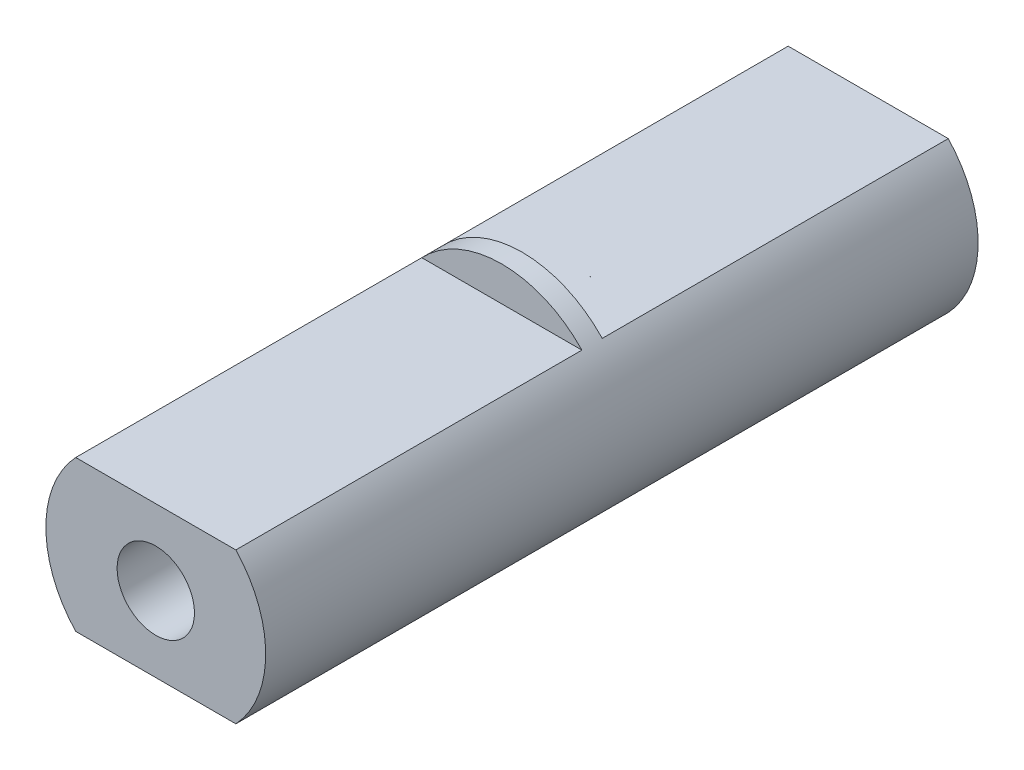
ISO-10303-21;
HEADER;
FILE_DESCRIPTION(('STEP AP214'),'2;1');
FILE_NAME('part.step','',(''),(''),'','','');
FILE_SCHEMA(('AUTOMOTIVE_DESIGN { 1 0 10303 214 1 1 1 1 }'));
ENDSEC;
DATA;
#1=APPLICATION_CONTEXT('core data for automotive mechanical design processes');
#2=APPLICATION_PROTOCOL_DEFINITION('international standard','automotive_design',2000,#1);
#3=PRODUCT_CONTEXT('',#1,'mechanical');
#4=PRODUCT('Part','Part','',(#3));
#5=PRODUCT_RELATED_PRODUCT_CATEGORY('part','',(#4));
#6=PRODUCT_DEFINITION_FORMATION('','',#4);
#7=PRODUCT_DEFINITION_CONTEXT('part definition',#1,'design');
#8=PRODUCT_DEFINITION('design','',#6,#7);
#9=PRODUCT_DEFINITION_SHAPE('','',#8);
#10=(LENGTH_UNIT() NAMED_UNIT(*) SI_UNIT(.MILLI.,.METRE.));
#11=(NAMED_UNIT(*) PLANE_ANGLE_UNIT() SI_UNIT($,.RADIAN.));
#12=(NAMED_UNIT(*) SI_UNIT($,.STERADIAN.) SOLID_ANGLE_UNIT());
#13=UNCERTAINTY_MEASURE_WITH_UNIT(LENGTH_MEASURE(1.E-05),#10,'distance_accuracy_value','');
#14=(GEOMETRIC_REPRESENTATION_CONTEXT(3) GLOBAL_UNCERTAINTY_ASSIGNED_CONTEXT((#13)) GLOBAL_UNIT_ASSIGNED_CONTEXT((#10,
#11,#12)) REPRESENTATION_CONTEXT('',''));
#15=CARTESIAN_POINT('',(0.,0.,0.));
#16=DIRECTION('',(0.,0.,1.));
#17=DIRECTION('',(1.,0.,0.));
#18=AXIS2_PLACEMENT_3D('',#15,#16,#17);
#19=CARTESIAN_POINT('',(0.,1.85,8.5));
#20=DIRECTION('',(0.,1.,0.));
#21=DIRECTION('',(0.,0.,1.));
#22=AXIS2_PLACEMENT_3D('',#19,#20,#21);
#23=PLANE('',#22);
#24=DIRECTION('',(1.,0.,0.));
#25=VECTOR('',#24,1.);
#26=CARTESIAN_POINT('',(0.,1.85,0.));
#27=LINE('',#26,#25);
#28=CARTESIAN_POINT('',(-1.96659612767848,1.85,0.));
#29=VERTEX_POINT('',#28);
#30=CARTESIAN_POINT('',(1.96659612767848,1.85,0.));
#31=VERTEX_POINT('',#30);
#32=EDGE_CURVE('E144',#29,#31,#27,.T.);
#33=ORIENTED_EDGE('',*,*,#32,.F.);
#34=DIRECTION('',(0.,0.,-1.));
#35=VECTOR('',#34,1.);
#36=CARTESIAN_POINT('',(-1.96659612767848,1.85,8.5));
#37=LINE('',#36,#35);
#38=CARTESIAN_POINT('',(-1.96659612767848,1.85,8.5));
#39=VERTEX_POINT('',#38);
#40=EDGE_CURVE('E49',#39,#29,#37,.T.);
#41=ORIENTED_EDGE('',*,*,#40,.F.);
#42=DIRECTION('',(1.,0.,0.));
#43=VECTOR('',#42,1.);
#44=CARTESIAN_POINT('',(0.,1.85,8.5));
#45=LINE('',#44,#43);
#46=CARTESIAN_POINT('',(1.96659612767848,1.85,8.5));
#47=VERTEX_POINT('',#46);
#48=EDGE_CURVE('E159',#39,#47,#45,.T.);
#49=ORIENTED_EDGE('',*,*,#48,.T.);
#50=DIRECTION('',(0.,0.,-1.));
#51=VECTOR('',#50,1.);
#52=CARTESIAN_POINT('',(1.96659612767848,1.85,8.5));
#53=LINE('',#52,#51);
#54=EDGE_CURVE('E11',#47,#31,#53,.T.);
#55=ORIENTED_EDGE('',*,*,#54,.T.);
#56=EDGE_LOOP('',(#33,#41,#49,#55));
#57=FACE_BOUND('',#56,.T.);
#58=ADVANCED_FACE('F40',(#57),#23,.T.);
#59=CARTESIAN_POINT('',(0.,0.,8.5));
#60=DIRECTION('',(0.,0.,-1.));
#61=DIRECTION('',(-1.,0.,0.));
#62=AXIS2_PLACEMENT_3D('',#59,#60,#61);
#63=CYLINDRICAL_SURFACE('',#62,2.700000061);
#64=ORIENTED_EDGE('',*,*,#40,.T.);
#65=CARTESIAN_POINT('',(0.,0.,0.));
#66=DIRECTION('',(0.,0.,-1.));
#67=DIRECTION('',(-1.,0.,0.));
#68=AXIS2_PLACEMENT_3D('',#65,#66,#67);
#69=CIRCLE('',#68,2.700000061);
#70=EDGE_CURVE('E145',#29,#31,#69,.T.);
#71=ORIENTED_EDGE('',*,*,#70,.T.);
#72=ORIENTED_EDGE('',*,*,#54,.F.);
#73=CARTESIAN_POINT('',(0.,0.,8.5));
#74=DIRECTION('',(0.,0.,1.));
#75=DIRECTION('',(1.,0.,0.));
#76=AXIS2_PLACEMENT_3D('',#73,#74,#75);
#77=CIRCLE('',#76,2.700000061);
#78=CARTESIAN_POINT('',(1.96659612767848,-1.85,8.5));
#79=VERTEX_POINT('',#78);
#80=EDGE_CURVE('E156',#79,#47,#77,.T.);
#81=ORIENTED_EDGE('',*,*,#80,.F.);
#82=DIRECTION('',(0.,0.,-1.));
#83=VECTOR('',#82,1.);
#84=CARTESIAN_POINT('',(1.96659612767848,-1.85,8.5));
#85=LINE('',#84,#83);
#86=CARTESIAN_POINT('',(1.96659612767848,-1.85,0.));
#87=VERTEX_POINT('',#86);
#88=EDGE_CURVE('E167',#79,#87,#85,.T.);
#89=ORIENTED_EDGE('',*,*,#88,.T.);
#90=CARTESIAN_POINT('',(-1.96659612767848,-1.85,0.));
#91=VERTEX_POINT('',#90);
#92=EDGE_CURVE('E140',#87,#91,#69,.T.);
#93=ORIENTED_EDGE('',*,*,#92,.T.);
#94=DIRECTION('',(0.,0.,-1.));
#95=VECTOR('',#94,1.);
#96=CARTESIAN_POINT('',(-1.96659612767848,-1.85,8.5));
#97=LINE('',#96,#95);
#98=CARTESIAN_POINT('',(-1.96659612767848,-1.85,8.5));
#99=VERTEX_POINT('',#98);
#100=EDGE_CURVE('E177',#99,#91,#97,.T.);
#101=ORIENTED_EDGE('',*,*,#100,.F.);
#102=CARTESIAN_POINT('',(0.,0.,8.5));
#103=DIRECTION('',(0.,0.,1.));
#104=DIRECTION('',(1.,0.,0.));
#105=AXIS2_PLACEMENT_3D('',#102,#103,#104);
#106=CIRCLE('',#105,2.700000061);
#107=EDGE_CURVE('E162',#39,#99,#106,.T.);
#108=ORIENTED_EDGE('',*,*,#107,.F.);
#109=EDGE_LOOP('',(#64,#71,#72,#81,#89,#93,#101,#108));
#110=FACE_BOUND('',#109,.T.);
#111=CARTESIAN_POINT('',(0.,0.,-0.499999999999999));
#112=DIRECTION('',(0.,0.,-1.));
#113=DIRECTION('',(-1.,0.,0.));
#114=AXIS2_PLACEMENT_3D('',#111,#112,#113);
#115=CIRCLE('',#114,2.700000061);
#116=CARTESIAN_POINT('',(1.96659612767848,-1.85,-0.499999999999999));
#117=VERTEX_POINT('',#116);
#118=CARTESIAN_POINT('',(-1.96659612767848,-1.85,-0.499999999999999));
#119=VERTEX_POINT('',#118);
#120=EDGE_CURVE('E109',#117,#119,#115,.T.);
#121=ORIENTED_EDGE('',*,*,#120,.F.);
#122=DIRECTION('',(0.,0.,-1.));
#123=VECTOR('',#122,1.);
#124=CARTESIAN_POINT('',(1.96659612767848,-1.85,-0.499999999999999));
#125=LINE('',#124,#123);
#126=CARTESIAN_POINT('',(1.96659612767848,-1.85,-9.));
#127=VERTEX_POINT('',#126);
#128=EDGE_CURVE('E117',#117,#127,#125,.T.);
#129=ORIENTED_EDGE('',*,*,#128,.T.);
#130=CARTESIAN_POINT('',(0.,0.,-9.));
#131=DIRECTION('',(0.,0.,-1.));
#132=DIRECTION('',(-1.,0.,0.));
#133=AXIS2_PLACEMENT_3D('',#130,#131,#132);
#134=CIRCLE('',#133,2.700000061);
#135=CARTESIAN_POINT('',(1.96659612767848,1.85,-9.));
#136=VERTEX_POINT('',#135);
#137=EDGE_CURVE('E141',#136,#127,#134,.T.);
#138=ORIENTED_EDGE('',*,*,#137,.F.);
#139=DIRECTION('',(0.,0.,-1.));
#140=VECTOR('',#139,1.);
#141=CARTESIAN_POINT('',(1.96659612767848,1.85,-0.499999999999999));
#142=LINE('',#141,#140);
#143=CARTESIAN_POINT('',(1.96659612767848,1.85,-0.499999999999999));
#144=VERTEX_POINT('',#143);
#145=EDGE_CURVE('E65',#144,#136,#142,.T.);
#146=ORIENTED_EDGE('',*,*,#145,.F.);
#147=CARTESIAN_POINT('',(0.,0.,-0.499999999999999));
#148=DIRECTION('',(0.,0.,-1.));
#149=DIRECTION('',(-1.,0.,0.));
#150=AXIS2_PLACEMENT_3D('',#147,#148,#149);
#151=CIRCLE('',#150,2.700000061);
#152=CARTESIAN_POINT('',(-1.96659612767848,1.85,-0.499999999999999));
#153=VERTEX_POINT('',#152);
#154=EDGE_CURVE('E128',#153,#144,#151,.T.);
#155=ORIENTED_EDGE('',*,*,#154,.F.);
#156=DIRECTION('',(0.,0.,-1.));
#157=VECTOR('',#156,1.);
#158=CARTESIAN_POINT('',(-1.96659612767848,1.85,-0.499999999999999));
#159=LINE('',#158,#157);
#160=CARTESIAN_POINT('',(-1.96659612767848,1.85,-9.));
#161=VERTEX_POINT('',#160);
#162=EDGE_CURVE('E134',#153,#161,#159,.T.);
#163=ORIENTED_EDGE('',*,*,#162,.T.);
#164=CARTESIAN_POINT('',(-1.96659612767848,-1.85,-9.));
#165=VERTEX_POINT('',#164);
#166=EDGE_CURVE('E122',#165,#161,#134,.T.);
#167=ORIENTED_EDGE('',*,*,#166,.F.);
#168=DIRECTION('',(0.,0.,-1.));
#169=VECTOR('',#168,1.);
#170=CARTESIAN_POINT('',(-1.96659612767848,-1.85,-0.499999999999999));
#171=LINE('',#170,#169);
#172=EDGE_CURVE('E57',#119,#165,#171,.T.);
#173=ORIENTED_EDGE('',*,*,#172,.F.);
#174=EDGE_LOOP('',(#121,#129,#138,#146,#155,#163,#167,#173));
#175=FACE_BOUND('',#174,.T.);
#176=ADVANCED_FACE('F120',(#110,#175),#63,.T.);
#177=CARTESIAN_POINT('',(0.,0.,8.5));
#178=DIRECTION('',(0.,0.,-1.));
#179=DIRECTION('',(-1.,0.,0.));
#180=AXIS2_PLACEMENT_3D('',#177,#178,#179);
#181=CYLINDRICAL_SURFACE('',#180,0.950000005);
#182=CARTESIAN_POINT('',(0.,0.,-9.));
#183=DIRECTION('',(0.,0.,-1.));
#184=DIRECTION('',(-1.,0.,0.));
#185=AXIS2_PLACEMENT_3D('',#182,#183,#184);
#186=CIRCLE('',#185,0.950000005);
#187=CARTESIAN_POINT('',(-0.950000005,0.,-9.));
#188=VERTEX_POINT('',#187);
#189=EDGE_CURVE('E136',#188,#188,#186,.T.);
#190=ORIENTED_EDGE('',*,*,#189,.T.);
#191=EDGE_LOOP('',(#190));
#192=FACE_BOUND('',#191,.T.);
#193=CARTESIAN_POINT('',(0.,0.,8.5));
#194=DIRECTION('',(0.,0.,1.));
#195=DIRECTION('',(1.,0.,0.));
#196=AXIS2_PLACEMENT_3D('',#193,#194,#195);
#197=CIRCLE('',#196,0.950000005);
#198=CARTESIAN_POINT('',(0.950000005,0.,8.5));
#199=VERTEX_POINT('',#198);
#200=EDGE_CURVE('E153',#199,#199,#197,.T.);
#201=ORIENTED_EDGE('',*,*,#200,.T.);
#202=EDGE_LOOP('',(#201));
#203=FACE_BOUND('',#202,.T.);
#204=ADVANCED_FACE('F42',(#192,#203),#181,.F.);
#205=CARTESIAN_POINT('',(0.,-1.85,8.5));
#206=DIRECTION('',(0.,-1.,0.));
#207=DIRECTION('',(0.,0.,-1.));
#208=AXIS2_PLACEMENT_3D('',#205,#206,#207);
#209=PLANE('',#208);
#210=DIRECTION('',(-1.,0.,0.));
#211=VECTOR('',#210,1.);
#212=CARTESIAN_POINT('',(0.,-1.85,0.));
#213=LINE('',#212,#211);
#214=EDGE_CURVE('E157',#87,#91,#213,.T.);
#215=ORIENTED_EDGE('',*,*,#214,.F.);
#216=ORIENTED_EDGE('',*,*,#88,.F.);
#217=DIRECTION('',(-1.,0.,0.));
#218=VECTOR('',#217,1.);
#219=CARTESIAN_POINT('',(0.,-1.85,8.5));
#220=LINE('',#219,#218);
#221=EDGE_CURVE('E164',#79,#99,#220,.T.);
#222=ORIENTED_EDGE('',*,*,#221,.T.);
#223=ORIENTED_EDGE('',*,*,#100,.T.);
#224=EDGE_LOOP('',(#215,#216,#222,#223));
#225=FACE_BOUND('',#224,.T.);
#226=ADVANCED_FACE('F192',(#225),#209,.T.);
#227=CARTESIAN_POINT('',(0.,0.,8.5));
#228=DIRECTION('',(0.,0.,1.));
#229=DIRECTION('',(1.,0.,0.));
#230=AXIS2_PLACEMENT_3D('',#227,#228,#229);
#231=PLANE('',#230);
#232=ORIENTED_EDGE('',*,*,#200,.F.);
#233=EDGE_LOOP('',(#232));
#234=FACE_BOUND('',#233,.T.);
#235=ORIENTED_EDGE('',*,*,#80,.T.);
#236=ORIENTED_EDGE('',*,*,#48,.F.);
#237=ORIENTED_EDGE('',*,*,#107,.T.);
#238=ORIENTED_EDGE('',*,*,#221,.F.);
#239=EDGE_LOOP('',(#235,#236,#237,#238));
#240=FACE_BOUND('',#239,.T.);
#241=ADVANCED_FACE('F197',(#234,#240),#231,.T.);
#242=CARTESIAN_POINT('',(0.,0.,0.));
#243=DIRECTION('',(0.,0.,-1.));
#244=DIRECTION('',(-1.,0.,0.));
#245=AXIS2_PLACEMENT_3D('',#242,#243,#244);
#246=PLANE('',#245);
#247=ORIENTED_EDGE('',*,*,#92,.F.);
#248=ORIENTED_EDGE('',*,*,#214,.T.);
#249=EDGE_LOOP('',(#247,#248));
#250=FACE_BOUND('',#249,.T.);
#251=ADVANCED_FACE('F194',(#250),#246,.F.);
#252=ORIENTED_EDGE('',*,*,#70,.F.);
#253=ORIENTED_EDGE('',*,*,#32,.T.);
#254=EDGE_LOOP('',(#252,#253));
#255=FACE_BOUND('',#254,.T.);
#256=ADVANCED_FACE('F196',(#255),#246,.F.);
#257=CARTESIAN_POINT('',(0.,0.,-9.));
#258=DIRECTION('',(0.,0.,-1.));
#259=DIRECTION('',(-1.,0.,0.));
#260=AXIS2_PLACEMENT_3D('',#257,#258,#259);
#261=PLANE('',#260);
#262=DIRECTION('',(1.,0.,0.));
#263=VECTOR('',#262,1.);
#264=CARTESIAN_POINT('',(-1.96659612767848,-1.85,-9.));
#265=LINE('',#264,#263);
#266=EDGE_CURVE('E114',#165,#127,#265,.T.);
#267=ORIENTED_EDGE('',*,*,#266,.F.);
#268=ORIENTED_EDGE('',*,*,#166,.T.);
#269=DIRECTION('',(-1.,0.,0.));
#270=VECTOR('',#269,1.);
#271=CARTESIAN_POINT('',(1.96659612767848,1.85,-9.));
#272=LINE('',#271,#270);
#273=EDGE_CURVE('E124',#136,#161,#272,.T.);
#274=ORIENTED_EDGE('',*,*,#273,.F.);
#275=ORIENTED_EDGE('',*,*,#137,.T.);
#276=EDGE_LOOP('',(#267,#268,#274,#275));
#277=FACE_BOUND('',#276,.T.);
#278=ORIENTED_EDGE('',*,*,#189,.F.);
#279=EDGE_LOOP('',(#278));
#280=FACE_BOUND('',#279,.T.);
#281=ADVANCED_FACE('F203',(#277,#280),#261,.T.);
#282=CARTESIAN_POINT('',(1.96659612767848,1.85,-0.499999999999999));
#283=DIRECTION('',(0.,-1.,0.));
#284=DIRECTION('',(0.,0.,-1.));
#285=AXIS2_PLACEMENT_3D('',#282,#283,#284);
#286=PLANE('',#285);
#287=ORIENTED_EDGE('',*,*,#273,.T.);
#288=ORIENTED_EDGE('',*,*,#162,.F.);
#289=DIRECTION('',(-1.,0.,0.));
#290=VECTOR('',#289,1.);
#291=CARTESIAN_POINT('',(1.96659612767848,1.85,-0.499999999999999));
#292=LINE('',#291,#290);
#293=EDGE_CURVE('E130',#144,#153,#292,.T.);
#294=ORIENTED_EDGE('',*,*,#293,.F.);
#295=ORIENTED_EDGE('',*,*,#145,.T.);
#296=EDGE_LOOP('',(#287,#288,#294,#295));
#297=FACE_BOUND('',#296,.T.);
#298=ADVANCED_FACE('F232',(#297),#286,.F.);
#299=CARTESIAN_POINT('',(0.,0.,-0.499999999999999));
#300=DIRECTION('',(0.,0.,-1.));
#301=DIRECTION('',(-1.,0.,0.));
#302=AXIS2_PLACEMENT_3D('',#299,#300,#301);
#303=PLANE('',#302);
#304=ORIENTED_EDGE('',*,*,#154,.T.);
#305=ORIENTED_EDGE('',*,*,#293,.T.);
#306=EDGE_LOOP('',(#304,#305));
#307=FACE_BOUND('',#306,.T.);
#308=ADVANCED_FACE('F237',(#307),#303,.T.);
#309=CARTESIAN_POINT('',(-1.96659612767848,-1.85,-0.499999999999999));
#310=DIRECTION('',(0.,1.,0.));
#311=DIRECTION('',(0.,0.,1.));
#312=AXIS2_PLACEMENT_3D('',#309,#310,#311);
#313=PLANE('',#312);
#314=ORIENTED_EDGE('',*,*,#266,.T.);
#315=ORIENTED_EDGE('',*,*,#128,.F.);
#316=DIRECTION('',(1.,0.,0.));
#317=VECTOR('',#316,1.);
#318=CARTESIAN_POINT('',(-1.96659612767848,-1.85,-0.499999999999999));
#319=LINE('',#318,#317);
#320=EDGE_CURVE('E111',#119,#117,#319,.T.);
#321=ORIENTED_EDGE('',*,*,#320,.F.);
#322=ORIENTED_EDGE('',*,*,#172,.T.);
#323=EDGE_LOOP('',(#314,#315,#321,#322));
#324=FACE_BOUND('',#323,.T.);
#325=ADVANCED_FACE('F116',(#324),#313,.F.);
#326=CARTESIAN_POINT('',(0.,0.,-0.499999999999999));
#327=DIRECTION('',(0.,0.,-1.));
#328=DIRECTION('',(-1.,0.,0.));
#329=AXIS2_PLACEMENT_3D('',#326,#327,#328);
#330=PLANE('',#329);
#331=ORIENTED_EDGE('',*,*,#120,.T.);
#332=ORIENTED_EDGE('',*,*,#320,.T.);
#333=EDGE_LOOP('',(#331,#332));
#334=FACE_BOUND('',#333,.T.);
#335=ADVANCED_FACE('F110',(#334),#330,.T.);
#336=CLOSED_SHELL('',(#58,#176,#204,#226,#241,#251,#256,#281,#298,#308,#325,#335));
#337=MANIFOLD_SOLID_BREP('B2',#336);
#338=ADVANCED_BREP_SHAPE_REPRESENTATION('',(#18,#337),#14);
#339=SHAPE_DEFINITION_REPRESENTATION(#9,#338);
ENDSEC;
END-ISO-10303-21;
